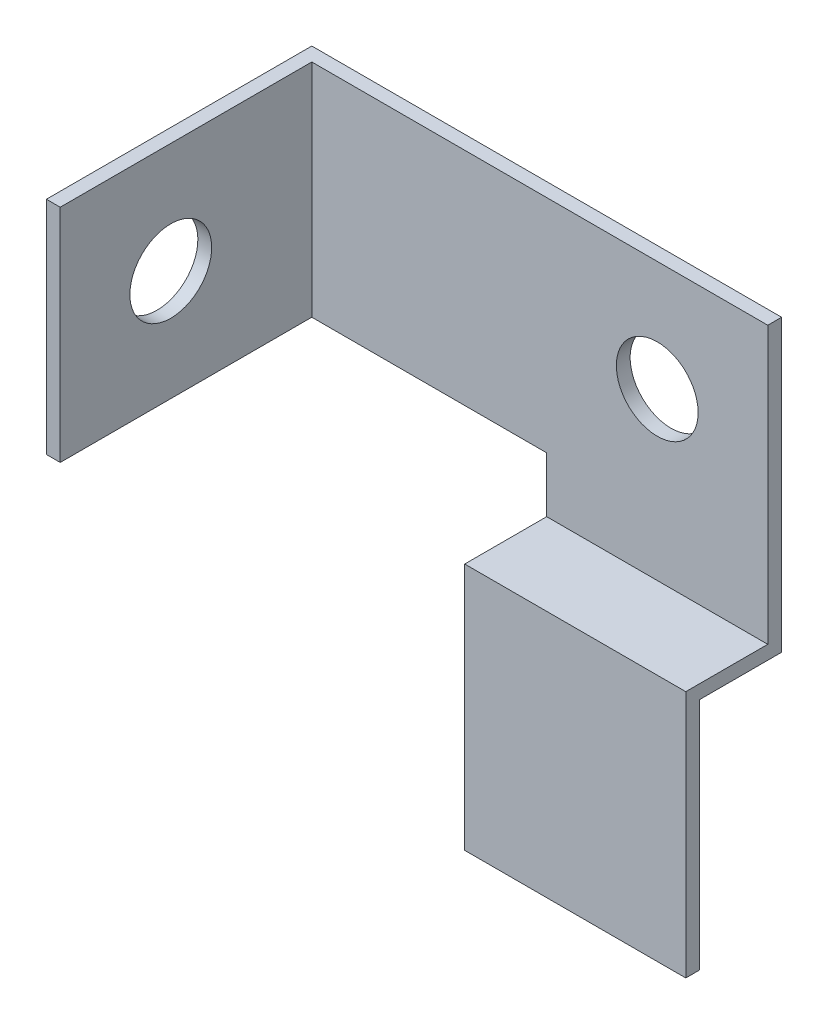
ISO-10303-21;
HEADER;
FILE_DESCRIPTION(('STEP AP214'),'2;1');
FILE_NAME('part.step','',(''),(''),'','','');
FILE_SCHEMA(('AUTOMOTIVE_DESIGN { 1 0 10303 214 1 1 1 1 }'));
ENDSEC;
DATA;
#1=APPLICATION_CONTEXT('core data for automotive mechanical design processes');
#2=APPLICATION_PROTOCOL_DEFINITION('international standard','automotive_design',2000,#1);
#3=PRODUCT_CONTEXT('',#1,'mechanical');
#4=PRODUCT('Part','Part','',(#3));
#5=PRODUCT_RELATED_PRODUCT_CATEGORY('part','',(#4));
#6=PRODUCT_DEFINITION_FORMATION('','',#4);
#7=PRODUCT_DEFINITION_CONTEXT('part definition',#1,'design');
#8=PRODUCT_DEFINITION('design','',#6,#7);
#9=PRODUCT_DEFINITION_SHAPE('','',#8);
#10=(LENGTH_UNIT() NAMED_UNIT(*) SI_UNIT(.MILLI.,.METRE.));
#11=(NAMED_UNIT(*) PLANE_ANGLE_UNIT() SI_UNIT($,.RADIAN.));
#12=(NAMED_UNIT(*) SI_UNIT($,.STERADIAN.) SOLID_ANGLE_UNIT());
#13=UNCERTAINTY_MEASURE_WITH_UNIT(LENGTH_MEASURE(1.E-05),#10,'distance_accuracy_value','');
#14=(GEOMETRIC_REPRESENTATION_CONTEXT(3) GLOBAL_UNCERTAINTY_ASSIGNED_CONTEXT((#13)) GLOBAL_UNIT_ASSIGNED_CONTEXT((#10,
#11,#12)) REPRESENTATION_CONTEXT('',''));
#15=CARTESIAN_POINT('',(0.,0.,0.));
#16=DIRECTION('',(0.,0.,1.));
#17=DIRECTION('',(1.,0.,0.));
#18=AXIS2_PLACEMENT_3D('',#15,#16,#17);
#19=CARTESIAN_POINT('',(-79.375,0.,35.582140799));
#20=DIRECTION('',(-1.,0.,0.));
#21=DIRECTION('',(0.,-1.,0.));
#22=AXIS2_PLACEMENT_3D('',#19,#20,#21);
#23=CYLINDRICAL_SURFACE('',#22,9.398);
#24=CARTESIAN_POINT('',(-79.375,0.,35.582140799));
#25=DIRECTION('',(-1.,0.,0.));
#26=DIRECTION('',(0.,-1.,0.));
#27=AXIS2_PLACEMENT_3D('',#24,#25,#26);
#28=CIRCLE('',#27,9.398);
#29=CARTESIAN_POINT('',(-79.375,-9.39800000000001,35.582140799));
#30=VERTEX_POINT('',#29);
#31=EDGE_CURVE('E20',#30,#30,#28,.F.);
#32=ORIENTED_EDGE('',*,*,#31,.T.);
#33=EDGE_LOOP('',(#32));
#34=FACE_BOUND('',#33,.T.);
#35=CARTESIAN_POINT('',(-82.55,0.,35.582140799));
#36=DIRECTION('',(-1.,0.,0.));
#37=DIRECTION('',(0.,-1.,0.));
#38=AXIS2_PLACEMENT_3D('',#35,#36,#37);
#39=CIRCLE('',#38,9.398);
#40=CARTESIAN_POINT('',(-82.55,-9.39800000000001,35.582140799));
#41=VERTEX_POINT('',#40);
#42=EDGE_CURVE('E127',#41,#41,#39,.F.);
#43=ORIENTED_EDGE('',*,*,#42,.F.);
#44=EDGE_LOOP('',(#43));
#45=FACE_BOUND('',#44,.T.);
#46=ADVANCED_FACE('F17',(#34,#45),#23,.F.);
#47=CARTESIAN_POINT('',(0.,-38.1,9.42026564));
#48=DIRECTION('',(0.,-1.,0.));
#49=DIRECTION('',(1.,0.,0.));
#50=AXIS2_PLACEMENT_3D('',#47,#48,#49);
#51=PLANE('',#50);
#52=DIRECTION('',(0.,0.,1.));
#53=VECTOR('',#52,1.);
#54=CARTESIAN_POINT('',(-25.4,-38.1,3.175));
#55=LINE('',#54,#53);
#56=CARTESIAN_POINT('',(-25.4,-38.1,22.01553128));
#57=VERTEX_POINT('',#56);
#58=CARTESIAN_POINT('',(-25.4,-38.1,3.175));
#59=VERTEX_POINT('',#58);
#60=EDGE_CURVE('E248',#57,#59,#55,.F.);
#61=ORIENTED_EDGE('',*,*,#60,.F.);
#62=DIRECTION('',(1.,0.,0.));
#63=VECTOR('',#62,1.);
#64=CARTESIAN_POINT('',(0.,-38.1,22.01553128));
#65=LINE('',#64,#63);
#66=CARTESIAN_POINT('',(25.4,-38.1,22.01553128));
#67=VERTEX_POINT('',#66);
#68=EDGE_CURVE('E144',#67,#57,#65,.F.);
#69=ORIENTED_EDGE('',*,*,#68,.F.);
#70=DIRECTION('',(0.,0.,1.));
#71=VECTOR('',#70,1.);
#72=CARTESIAN_POINT('',(25.4,-38.1,0.));
#73=LINE('',#72,#71);
#74=CARTESIAN_POINT('',(25.4,-38.1,3.175));
#75=VERTEX_POINT('',#74);
#76=EDGE_CURVE('E236',#75,#67,#73,.T.);
#77=ORIENTED_EDGE('',*,*,#76,.F.);
#78=DIRECTION('',(1.,0.,0.));
#79=VECTOR('',#78,1.);
#80=CARTESIAN_POINT('',(-26.9875,-38.1,3.175));
#81=LINE('',#80,#79);
#82=EDGE_CURVE('E119',#59,#75,#81,.T.);
#83=ORIENTED_EDGE('',*,*,#82,.F.);
#84=EDGE_LOOP('',(#61,#69,#77,#83));
#85=FACE_BOUND('',#84,.T.);
#86=ADVANCED_FACE('F157',(#85),#51,.F.);
#87=CARTESIAN_POINT('',(0.,-66.5912975512,22.01553128));
#88=DIRECTION('',(0.,0.,1.));
#89=DIRECTION('',(1.,0.,0.));
#90=AXIS2_PLACEMENT_3D('',#87,#88,#89);
#91=PLANE('',#90);
#92=DIRECTION('',(1.,0.,0.));
#93=VECTOR('',#92,1.);
#94=CARTESIAN_POINT('',(-25.4,-95.0825951024,22.01553128));
#95=LINE('',#94,#93);
#96=CARTESIAN_POINT('',(25.4,-95.0825951024,22.01553128));
#97=VERTEX_POINT('',#96);
#98=CARTESIAN_POINT('',(-25.4,-95.0825951024,22.01553128));
#99=VERTEX_POINT('',#98);
#100=EDGE_CURVE('E142',#97,#99,#95,.F.);
#101=ORIENTED_EDGE('',*,*,#100,.F.);
#102=DIRECTION('',(0.,1.,0.));
#103=VECTOR('',#102,1.);
#104=CARTESIAN_POINT('',(25.4,-25.4,22.01553128));
#105=LINE('',#104,#103);
#106=EDGE_CURVE('E224',#67,#97,#105,.F.);
#107=ORIENTED_EDGE('',*,*,#106,.F.);
#108=ORIENTED_EDGE('',*,*,#68,.T.);
#109=DIRECTION('',(0.,1.,0.));
#110=VECTOR('',#109,1.);
#111=CARTESIAN_POINT('',(-25.4,-38.1,22.01553128));
#112=LINE('',#111,#110);
#113=EDGE_CURVE('E226',#99,#57,#112,.T.);
#114=ORIENTED_EDGE('',*,*,#113,.F.);
#115=EDGE_LOOP('',(#101,#107,#108,#114));
#116=FACE_BOUND('',#115,.T.);
#117=ADVANCED_FACE('F163',(#116),#91,.T.);
#118=CARTESIAN_POINT('',(-25.4,-95.0825951024,18.84053128));
#119=DIRECTION('',(0.,-1.,0.));
#120=DIRECTION('',(1.,0.,0.));
#121=AXIS2_PLACEMENT_3D('',#118,#119,#120);
#122=PLANE('',#121);
#123=ORIENTED_EDGE('',*,*,#100,.T.);
#124=DIRECTION('',(0.,0.,1.));
#125=VECTOR('',#124,1.);
#126=CARTESIAN_POINT('',(-25.4,-95.0825951024,3.175));
#127=LINE('',#126,#125);
#128=CARTESIAN_POINT('',(-25.4,-95.0825951024,18.84053128));
#129=VERTEX_POINT('',#128);
#130=EDGE_CURVE('E252',#129,#99,#127,.T.);
#131=ORIENTED_EDGE('',*,*,#130,.F.);
#132=DIRECTION('',(-1.,0.,0.));
#133=VECTOR('',#132,1.);
#134=CARTESIAN_POINT('',(0.,-95.0825951024,18.84053128));
#135=LINE('',#134,#133);
#136=CARTESIAN_POINT('',(25.4,-95.0825951024,18.84053128));
#137=VERTEX_POINT('',#136);
#138=EDGE_CURVE('E140',#137,#129,#135,.T.);
#139=ORIENTED_EDGE('',*,*,#138,.F.);
#140=DIRECTION('',(0.,0.,1.));
#141=VECTOR('',#140,1.);
#142=CARTESIAN_POINT('',(25.4,-95.0825951024,0.));
#143=LINE('',#142,#141);
#144=EDGE_CURVE('E230',#97,#137,#143,.F.);
#145=ORIENTED_EDGE('',*,*,#144,.F.);
#146=EDGE_LOOP('',(#123,#131,#139,#145));
#147=FACE_BOUND('',#146,.T.);
#148=ADVANCED_FACE('F211',(#147),#122,.T.);
#149=CARTESIAN_POINT('',(0.,-66.5912975512,18.84053128));
#150=DIRECTION('',(0.,0.,-1.));
#151=DIRECTION('',(-1.,0.,0.));
#152=AXIS2_PLACEMENT_3D('',#149,#150,#151);
#153=PLANE('',#152);
#154=ORIENTED_EDGE('',*,*,#138,.T.);
#155=DIRECTION('',(0.,1.,0.));
#156=VECTOR('',#155,1.);
#157=CARTESIAN_POINT('',(-25.4,-38.1,18.84053128));
#158=LINE('',#157,#156);
#159=CARTESIAN_POINT('',(-25.4,-41.275,18.84053128));
#160=VERTEX_POINT('',#159);
#161=EDGE_CURVE('E254',#160,#129,#158,.F.);
#162=ORIENTED_EDGE('',*,*,#161,.F.);
#163=DIRECTION('',(1.,0.,0.));
#164=VECTOR('',#163,1.);
#165=CARTESIAN_POINT('',(0.,-41.275,18.84053128));
#166=LINE('',#165,#164);
#167=CARTESIAN_POINT('',(25.4,-41.275,18.84053128));
#168=VERTEX_POINT('',#167);
#169=EDGE_CURVE('E246',#168,#160,#166,.F.);
#170=ORIENTED_EDGE('',*,*,#169,.F.);
#171=DIRECTION('',(0.,1.,0.));
#172=VECTOR('',#171,1.);
#173=CARTESIAN_POINT('',(25.4,-25.4,18.84053128));
#174=LINE('',#173,#172);
#175=EDGE_CURVE('E232',#137,#168,#174,.T.);
#176=ORIENTED_EDGE('',*,*,#175,.F.);
#177=EDGE_LOOP('',(#154,#162,#170,#176));
#178=FACE_BOUND('',#177,.T.);
#179=ADVANCED_FACE('F207',(#178),#153,.T.);
#180=CARTESIAN_POINT('',(-82.55,25.4,60.982140799));
#181=DIRECTION('',(0.,0.,1.));
#182=DIRECTION('',(1.,0.,0.));
#183=AXIS2_PLACEMENT_3D('',#180,#181,#182);
#184=PLANE('',#183);
#185=DIRECTION('',(0.,1.,0.));
#186=VECTOR('',#185,1.);
#187=CARTESIAN_POINT('',(-82.55,0.,60.982140799));
#188=LINE('',#187,#186);
#189=CARTESIAN_POINT('',(-82.55,-25.4,60.982140799));
#190=VERTEX_POINT('',#189);
#191=CARTESIAN_POINT('',(-82.55,25.4,60.982140799));
#192=VERTEX_POINT('',#191);
#193=EDGE_CURVE('E136',#190,#192,#188,.T.);
#194=ORIENTED_EDGE('',*,*,#193,.F.);
#195=DIRECTION('',(1.,0.,0.));
#196=VECTOR('',#195,1.);
#197=CARTESIAN_POINT('',(-79.375,-25.4,60.982140799));
#198=LINE('',#197,#196);
#199=CARTESIAN_POINT('',(-79.375,-25.4,60.982140799));
#200=VERTEX_POINT('',#199);
#201=EDGE_CURVE('E130',#200,#190,#198,.F.);
#202=ORIENTED_EDGE('',*,*,#201,.F.);
#203=DIRECTION('',(0.,-1.,0.));
#204=VECTOR('',#203,1.);
#205=CARTESIAN_POINT('',(-79.375,0.,60.982140799));
#206=LINE('',#205,#204);
#207=CARTESIAN_POINT('',(-79.375,25.4,60.982140799));
#208=VERTEX_POINT('',#207);
#209=EDGE_CURVE('E104',#200,#208,#206,.F.);
#210=ORIENTED_EDGE('',*,*,#209,.T.);
#211=DIRECTION('',(-1.,0.,0.));
#212=VECTOR('',#211,1.);
#213=CARTESIAN_POINT('',(25.4,25.4,60.982140799));
#214=LINE('',#213,#212);
#215=EDGE_CURVE('E280',#192,#208,#214,.F.);
#216=ORIENTED_EDGE('',*,*,#215,.F.);
#217=EDGE_LOOP('',(#194,#202,#210,#216));
#218=FACE_BOUND('',#217,.T.);
#219=ADVANCED_FACE('F203',(#218),#184,.T.);
#220=CARTESIAN_POINT('',(-79.375,0.,170.1910703995));
#221=DIRECTION('',(-1.,0.,0.));
#222=DIRECTION('',(0.,-1.,0.));
#223=AXIS2_PLACEMENT_3D('',#220,#221,#222);
#224=PLANE('',#223);
#225=ORIENTED_EDGE('',*,*,#31,.F.);
#226=EDGE_LOOP('',(#225));
#227=FACE_BOUND('',#226,.T.);
#228=DIRECTION('',(0.,0.,1.));
#229=VECTOR('',#228,1.);
#230=CARTESIAN_POINT('',(-79.375,-25.4,0.));
#231=LINE('',#230,#229);
#232=CARTESIAN_POINT('',(-79.375,-25.4,3.175));
#233=VERTEX_POINT('',#232);
#234=EDGE_CURVE('E123',#233,#200,#231,.T.);
#235=ORIENTED_EDGE('',*,*,#234,.F.);
#236=DIRECTION('',(0.,1.,0.));
#237=VECTOR('',#236,1.);
#238=CARTESIAN_POINT('',(-79.375,0.,3.175));
#239=LINE('',#238,#237);
#240=CARTESIAN_POINT('',(-79.375,25.4,3.17500000000001));
#241=VERTEX_POINT('',#240);
#242=EDGE_CURVE('E111',#241,#233,#239,.F.);
#243=ORIENTED_EDGE('',*,*,#242,.F.);
#244=DIRECTION('',(0.,0.,1.));
#245=VECTOR('',#244,1.);
#246=CARTESIAN_POINT('',(-79.375,25.4,0.));
#247=LINE('',#246,#245);
#248=EDGE_CURVE('E278',#208,#241,#247,.F.);
#249=ORIENTED_EDGE('',*,*,#248,.F.);
#250=ORIENTED_EDGE('',*,*,#209,.F.);
#251=EDGE_LOOP('',(#235,#243,#249,#250));
#252=FACE_BOUND('',#251,.T.);
#253=ADVANCED_FACE('F129',(#227,#252),#224,.F.);
#254=CARTESIAN_POINT('',(-26.9875,0.,3.175));
#255=DIRECTION('',(0.,0.,1.));
#256=DIRECTION('',(1.,0.,0.));
#257=AXIS2_PLACEMENT_3D('',#254,#255,#256);
#258=PLANE('',#257);
#259=CARTESIAN_POINT('',(0.,0.,3.175));
#260=DIRECTION('',(0.,0.,1.));
#261=DIRECTION('',(1.,0.,0.));
#262=AXIS2_PLACEMENT_3D('',#259,#260,#261);
#263=CIRCLE('',#262,9.398);
#264=CARTESIAN_POINT('',(9.398,0.,3.175));
#265=VERTEX_POINT('',#264);
#266=EDGE_CURVE('E146',#265,#265,#263,.F.);
#267=ORIENTED_EDGE('',*,*,#266,.T.);
#268=EDGE_LOOP('',(#267));
#269=FACE_BOUND('',#268,.T.);
#270=ORIENTED_EDGE('',*,*,#82,.T.);
#271=DIRECTION('',(0.,1.,0.));
#272=VECTOR('',#271,1.);
#273=CARTESIAN_POINT('',(25.4,-25.4,3.175));
#274=LINE('',#273,#272);
#275=CARTESIAN_POINT('',(25.4,25.4,3.175));
#276=VERTEX_POINT('',#275);
#277=EDGE_CURVE('E241',#276,#75,#274,.F.);
#278=ORIENTED_EDGE('',*,*,#277,.F.);
#279=DIRECTION('',(-1.,0.,0.));
#280=VECTOR('',#279,1.);
#281=CARTESIAN_POINT('',(25.4,25.4,3.175));
#282=LINE('',#281,#280);
#283=EDGE_CURVE('E118',#241,#276,#282,.F.);
#284=ORIENTED_EDGE('',*,*,#283,.F.);
#285=ORIENTED_EDGE('',*,*,#242,.T.);
#286=DIRECTION('',(1.,0.,0.));
#287=VECTOR('',#286,1.);
#288=CARTESIAN_POINT('',(-79.375,-25.4,3.175));
#289=LINE('',#288,#287);
#290=CARTESIAN_POINT('',(-25.4,-25.4,3.175));
#291=VERTEX_POINT('',#290);
#292=EDGE_CURVE('E115',#291,#233,#289,.F.);
#293=ORIENTED_EDGE('',*,*,#292,.F.);
#294=DIRECTION('',(0.,1.,0.));
#295=VECTOR('',#294,1.);
#296=CARTESIAN_POINT('',(-25.4,-38.1,3.175));
#297=LINE('',#296,#295);
#298=EDGE_CURVE('E258',#59,#291,#297,.T.);
#299=ORIENTED_EDGE('',*,*,#298,.F.);
#300=EDGE_LOOP('',(#270,#278,#284,#285,#293,#299));
#301=FACE_BOUND('',#300,.T.);
#302=ADVANCED_FACE('F113',(#269,#301),#258,.T.);
#303=CARTESIAN_POINT('',(-82.55,0.,170.1910703995));
#304=DIRECTION('',(-1.,0.,0.));
#305=DIRECTION('',(0.,0.,1.));
#306=AXIS2_PLACEMENT_3D('',#303,#304,#305);
#307=PLANE('',#306);
#308=ORIENTED_EDGE('',*,*,#42,.T.);
#309=EDGE_LOOP('',(#308));
#310=FACE_BOUND('',#309,.T.);
#311=DIRECTION('',(0.,1.,0.));
#312=VECTOR('',#311,1.);
#313=CARTESIAN_POINT('',(-82.55,0.,0.));
#314=LINE('',#313,#312);
#315=CARTESIAN_POINT('',(-82.55,25.4,0.));
#316=VERTEX_POINT('',#315);
#317=CARTESIAN_POINT('',(-82.55,-25.4,0.));
#318=VERTEX_POINT('',#317);
#319=EDGE_CURVE('E148',#316,#318,#314,.F.);
#320=ORIENTED_EDGE('',*,*,#319,.T.);
#321=DIRECTION('',(0.,0.,1.));
#322=VECTOR('',#321,1.);
#323=CARTESIAN_POINT('',(-82.55,-25.4,0.));
#324=LINE('',#323,#322);
#325=EDGE_CURVE('E132',#190,#318,#324,.F.);
#326=ORIENTED_EDGE('',*,*,#325,.F.);
#327=ORIENTED_EDGE('',*,*,#193,.T.);
#328=DIRECTION('',(0.,0.,1.));
#329=VECTOR('',#328,1.);
#330=CARTESIAN_POINT('',(-82.55,25.4,0.));
#331=LINE('',#330,#329);
#332=EDGE_CURVE('E149',#316,#192,#331,.T.);
#333=ORIENTED_EDGE('',*,*,#332,.F.);
#334=EDGE_LOOP('',(#320,#326,#327,#333));
#335=FACE_BOUND('',#334,.T.);
#336=ADVANCED_FACE('F153',(#310,#335),#307,.T.);
#337=CARTESIAN_POINT('',(-79.375,-25.4,0.));
#338=DIRECTION('',(0.,-1.,0.));
#339=DIRECTION('',(1.,0.,0.));
#340=AXIS2_PLACEMENT_3D('',#337,#338,#339);
#341=PLANE('',#340);
#342=ORIENTED_EDGE('',*,*,#325,.T.);
#343=DIRECTION('',(1.,0.,0.));
#344=VECTOR('',#343,1.);
#345=CARTESIAN_POINT('',(-26.9875,-25.4,0.));
#346=LINE('',#345,#344);
#347=CARTESIAN_POINT('',(-25.4,-25.4,0.));
#348=VERTEX_POINT('',#347);
#349=EDGE_CURVE('E261',#318,#348,#346,.T.);
#350=ORIENTED_EDGE('',*,*,#349,.T.);
#351=DIRECTION('',(0.,0.,1.));
#352=VECTOR('',#351,1.);
#353=CARTESIAN_POINT('',(-25.4,-25.4,3.175));
#354=LINE('',#353,#352);
#355=EDGE_CURVE('E126',#291,#348,#354,.F.);
#356=ORIENTED_EDGE('',*,*,#355,.F.);
#357=ORIENTED_EDGE('',*,*,#292,.T.);
#358=ORIENTED_EDGE('',*,*,#234,.T.);
#359=ORIENTED_EDGE('',*,*,#201,.T.);
#360=EDGE_LOOP('',(#342,#350,#356,#357,#358,#359));
#361=FACE_BOUND('',#360,.T.);
#362=ADVANCED_FACE('F122',(#361),#341,.T.);
#363=CARTESIAN_POINT('',(-25.4,-38.1,3.175));
#364=DIRECTION('',(-1.,0.,0.));
#365=DIRECTION('',(0.,0.,1.));
#366=AXIS2_PLACEMENT_3D('',#363,#364,#365);
#367=PLANE('',#366);
#368=ORIENTED_EDGE('',*,*,#113,.T.);
#369=ORIENTED_EDGE('',*,*,#60,.T.);
#370=ORIENTED_EDGE('',*,*,#298,.T.);
#371=ORIENTED_EDGE('',*,*,#355,.T.);
#372=DIRECTION('',(0.,1.,0.));
#373=VECTOR('',#372,1.);
#374=CARTESIAN_POINT('',(-25.4,0.,0.));
#375=LINE('',#374,#373);
#376=CARTESIAN_POINT('',(-25.4,-41.275,0.));
#377=VERTEX_POINT('',#376);
#378=EDGE_CURVE('E269',#348,#377,#375,.F.);
#379=ORIENTED_EDGE('',*,*,#378,.T.);
#380=DIRECTION('',(0.,0.,-1.));
#381=VECTOR('',#380,1.);
#382=CARTESIAN_POINT('',(-25.4,-41.275,9.42026564));
#383=LINE('',#382,#381);
#384=EDGE_CURVE('E244',#160,#377,#383,.T.);
#385=ORIENTED_EDGE('',*,*,#384,.F.);
#386=ORIENTED_EDGE('',*,*,#161,.T.);
#387=ORIENTED_EDGE('',*,*,#130,.T.);
#388=EDGE_LOOP('',(#368,#369,#370,#371,#379,#385,#386,#387));
#389=FACE_BOUND('',#388,.T.);
#390=ADVANCED_FACE('F189',(#389),#367,.T.);
#391=CARTESIAN_POINT('',(0.,-41.275,9.42026564));
#392=DIRECTION('',(0.,-1.,0.));
#393=DIRECTION('',(0.,0.,-1.));
#394=AXIS2_PLACEMENT_3D('',#391,#392,#393);
#395=PLANE('',#394);
#396=ORIENTED_EDGE('',*,*,#169,.T.);
#397=ORIENTED_EDGE('',*,*,#384,.T.);
#398=DIRECTION('',(1.,0.,0.));
#399=VECTOR('',#398,1.);
#400=CARTESIAN_POINT('',(-26.9875,-41.275,0.));
#401=LINE('',#400,#399);
#402=CARTESIAN_POINT('',(25.4,-41.275,0.));
#403=VERTEX_POINT('',#402);
#404=EDGE_CURVE('E286',#377,#403,#401,.T.);
#405=ORIENTED_EDGE('',*,*,#404,.T.);
#406=DIRECTION('',(0.,0.,1.));
#407=VECTOR('',#406,1.);
#408=CARTESIAN_POINT('',(25.4,-41.275,0.));
#409=LINE('',#408,#407);
#410=EDGE_CURVE('E234',#168,#403,#409,.F.);
#411=ORIENTED_EDGE('',*,*,#410,.F.);
#412=EDGE_LOOP('',(#396,#397,#405,#411));
#413=FACE_BOUND('',#412,.T.);
#414=ADVANCED_FACE('F185',(#413),#395,.T.);
#415=CARTESIAN_POINT('',(25.4,-25.4,0.));
#416=DIRECTION('',(1.,0.,0.));
#417=DIRECTION('',(0.,1.,0.));
#418=AXIS2_PLACEMENT_3D('',#415,#416,#417);
#419=PLANE('',#418);
#420=ORIENTED_EDGE('',*,*,#175,.T.);
#421=ORIENTED_EDGE('',*,*,#410,.T.);
#422=DIRECTION('',(0.,1.,0.));
#423=VECTOR('',#422,1.);
#424=CARTESIAN_POINT('',(25.4,0.,0.));
#425=LINE('',#424,#423);
#426=CARTESIAN_POINT('',(25.4,25.4,0.));
#427=VERTEX_POINT('',#426);
#428=EDGE_CURVE('E283',#403,#427,#425,.T.);
#429=ORIENTED_EDGE('',*,*,#428,.T.);
#430=DIRECTION('',(0.,0.,1.));
#431=VECTOR('',#430,1.);
#432=CARTESIAN_POINT('',(25.4,25.4,0.));
#433=LINE('',#432,#431);
#434=EDGE_CURVE('E35',#276,#427,#433,.F.);
#435=ORIENTED_EDGE('',*,*,#434,.F.);
#436=ORIENTED_EDGE('',*,*,#277,.T.);
#437=ORIENTED_EDGE('',*,*,#76,.T.);
#438=ORIENTED_EDGE('',*,*,#106,.T.);
#439=ORIENTED_EDGE('',*,*,#144,.T.);
#440=EDGE_LOOP('',(#420,#421,#429,#435,#436,#437,#438,#439));
#441=FACE_BOUND('',#440,.T.);
#442=ADVANCED_FACE('F182',(#441),#419,.T.);
#443=CARTESIAN_POINT('',(25.4,25.4,0.));
#444=DIRECTION('',(0.,1.,0.));
#445=DIRECTION('',(-1.,0.,0.));
#446=AXIS2_PLACEMENT_3D('',#443,#444,#445);
#447=PLANE('',#446);
#448=DIRECTION('',(1.,0.,0.));
#449=VECTOR('',#448,1.);
#450=CARTESIAN_POINT('',(-26.9875,25.4,0.));
#451=LINE('',#450,#449);
#452=EDGE_CURVE('E26',#427,#316,#451,.F.);
#453=ORIENTED_EDGE('',*,*,#452,.T.);
#454=ORIENTED_EDGE('',*,*,#332,.T.);
#455=ORIENTED_EDGE('',*,*,#215,.T.);
#456=ORIENTED_EDGE('',*,*,#248,.T.);
#457=ORIENTED_EDGE('',*,*,#283,.T.);
#458=ORIENTED_EDGE('',*,*,#434,.T.);
#459=EDGE_LOOP('',(#453,#454,#455,#456,#457,#458));
#460=FACE_BOUND('',#459,.T.);
#461=ADVANCED_FACE('F174',(#460),#447,.T.);
#462=CARTESIAN_POINT('',(0.,0.,0.));
#463=DIRECTION('',(0.,0.,1.));
#464=DIRECTION('',(1.,0.,0.));
#465=AXIS2_PLACEMENT_3D('',#462,#463,#464);
#466=CYLINDRICAL_SURFACE('',#465,9.398);
#467=CARTESIAN_POINT('',(0.,0.,0.));
#468=DIRECTION('',(0.,0.,1.));
#469=DIRECTION('',(1.,0.,0.));
#470=AXIS2_PLACEMENT_3D('',#467,#468,#469);
#471=CIRCLE('',#470,9.398);
#472=CARTESIAN_POINT('',(9.398,0.,0.));
#473=VERTEX_POINT('',#472);
#474=EDGE_CURVE('E11',#473,#473,#471,.F.);
#475=ORIENTED_EDGE('',*,*,#474,.T.);
#476=EDGE_LOOP('',(#475));
#477=FACE_BOUND('',#476,.T.);
#478=ORIENTED_EDGE('',*,*,#266,.F.);
#479=EDGE_LOOP('',(#478));
#480=FACE_BOUND('',#479,.T.);
#481=ADVANCED_FACE('F168',(#477,#480),#466,.F.);
#482=CARTESIAN_POINT('',(-26.9875,0.,0.));
#483=DIRECTION('',(0.,0.,1.));
#484=DIRECTION('',(1.,0.,0.));
#485=AXIS2_PLACEMENT_3D('',#482,#483,#484);
#486=PLANE('',#485);
#487=ORIENTED_EDGE('',*,*,#474,.F.);
#488=EDGE_LOOP('',(#487));
#489=FACE_BOUND('',#488,.T.);
#490=ORIENTED_EDGE('',*,*,#428,.F.);
#491=ORIENTED_EDGE('',*,*,#404,.F.);
#492=ORIENTED_EDGE('',*,*,#378,.F.);
#493=ORIENTED_EDGE('',*,*,#349,.F.);
#494=ORIENTED_EDGE('',*,*,#319,.F.);
#495=ORIENTED_EDGE('',*,*,#452,.F.);
#496=EDGE_LOOP('',(#490,#491,#492,#493,#494,#495));
#497=FACE_BOUND('',#496,.T.);
#498=ADVANCED_FACE('F166',(#489,#497),#486,.F.);
#499=CLOSED_SHELL('',(#46,#86,#117,#148,#179,#219,#253,#302,#336,#362,#390,#414,#442,#461,#481,#498));
#500=MANIFOLD_SOLID_BREP('B1',#499);
#501=ADVANCED_BREP_SHAPE_REPRESENTATION('',(#18,#500),#14);
#502=SHAPE_DEFINITION_REPRESENTATION(#9,#501);
ENDSEC;
END-ISO-10303-21;
